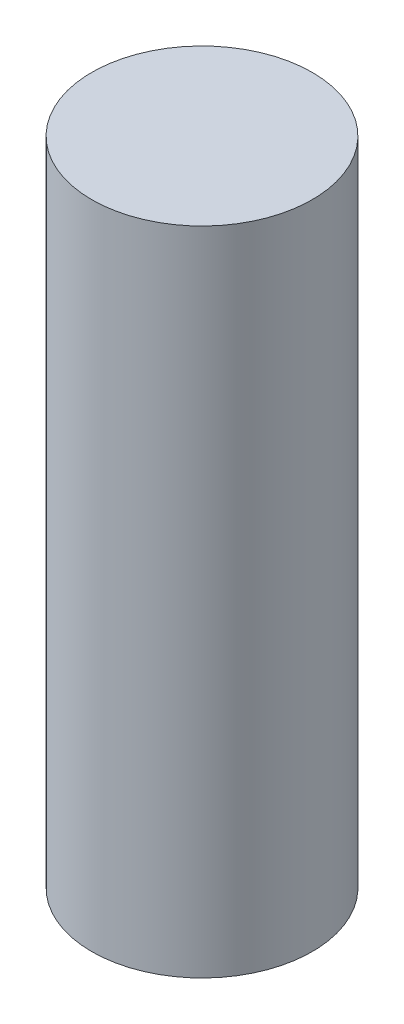
ISO-10303-21;
HEADER;
FILE_DESCRIPTION(('STEP AP214'),'2;1');
FILE_NAME('part.step','',(''),(''),'','','');
FILE_SCHEMA(('AUTOMOTIVE_DESIGN { 1 0 10303 214 1 1 1 1 }'));
ENDSEC;
DATA;
#1=APPLICATION_CONTEXT('core data for automotive mechanical design processes');
#2=APPLICATION_PROTOCOL_DEFINITION('international standard','automotive_design',2000,#1);
#3=PRODUCT_CONTEXT('',#1,'mechanical');
#4=PRODUCT('Part','Part','',(#3));
#5=PRODUCT_RELATED_PRODUCT_CATEGORY('part','',(#4));
#6=PRODUCT_DEFINITION_FORMATION('','',#4);
#7=PRODUCT_DEFINITION_CONTEXT('part definition',#1,'design');
#8=PRODUCT_DEFINITION('design','',#6,#7);
#9=PRODUCT_DEFINITION_SHAPE('','',#8);
#10=(LENGTH_UNIT() NAMED_UNIT(*) SI_UNIT(.MILLI.,.METRE.));
#11=(NAMED_UNIT(*) PLANE_ANGLE_UNIT() SI_UNIT($,.RADIAN.));
#12=(NAMED_UNIT(*) SI_UNIT($,.STERADIAN.) SOLID_ANGLE_UNIT());
#13=UNCERTAINTY_MEASURE_WITH_UNIT(LENGTH_MEASURE(1.E-05),#10,'distance_accuracy_value','');
#14=(GEOMETRIC_REPRESENTATION_CONTEXT(3) GLOBAL_UNCERTAINTY_ASSIGNED_CONTEXT((#13)) GLOBAL_UNIT_ASSIGNED_CONTEXT((#10,
#11,#12)) REPRESENTATION_CONTEXT('',''));
#15=CARTESIAN_POINT('',(0.,0.,0.));
#16=DIRECTION('',(0.,0.,1.));
#17=DIRECTION('',(1.,0.,0.));
#18=AXIS2_PLACEMENT_3D('',#15,#16,#17);
#19=CARTESIAN_POINT('',(0.,450.,0.));
#20=DIRECTION('',(0.,-1.,0.));
#21=DIRECTION('',(0.,0.,-1.));
#22=AXIS2_PLACEMENT_3D('',#19,#20,#21);
#23=CYLINDRICAL_SURFACE('',#22,76.2);
#24=CARTESIAN_POINT('',(0.,0.,0.));
#25=DIRECTION('',(0.,1.,0.));
#26=DIRECTION('',(0.,0.,1.));
#27=AXIS2_PLACEMENT_3D('',#24,#25,#26);
#28=CIRCLE('',#27,76.2);
#29=CARTESIAN_POINT('',(0.,0.,76.2));
#30=VERTEX_POINT('',#29);
#31=EDGE_CURVE('E42',#30,#30,#28,.T.);
#32=ORIENTED_EDGE('',*,*,#31,.T.);
#33=EDGE_LOOP('',(#32));
#34=FACE_BOUND('',#33,.T.);
#35=CARTESIAN_POINT('',(0.,450.,0.));
#36=DIRECTION('',(0.,1.,0.));
#37=DIRECTION('',(0.,0.,1.));
#38=AXIS2_PLACEMENT_3D('',#35,#36,#37);
#39=CIRCLE('',#38,76.2);
#40=CARTESIAN_POINT('',(0.,450.,76.2));
#41=VERTEX_POINT('',#40);
#42=EDGE_CURVE('E10',#41,#41,#39,.T.);
#43=ORIENTED_EDGE('',*,*,#42,.F.);
#44=EDGE_LOOP('',(#43));
#45=FACE_BOUND('',#44,.T.);
#46=ADVANCED_FACE('F39',(#34,#45),#23,.T.);
#47=CARTESIAN_POINT('',(0.,450.,0.));
#48=DIRECTION('',(0.,1.,0.));
#49=DIRECTION('',(0.,0.,1.));
#50=AXIS2_PLACEMENT_3D('',#47,#48,#49);
#51=PLANE('',#50);
#52=ORIENTED_EDGE('',*,*,#42,.T.);
#53=EDGE_LOOP('',(#52));
#54=FACE_BOUND('',#53,.T.);
#55=ADVANCED_FACE('F57',(#54),#51,.T.);
#56=CARTESIAN_POINT('',(0.,0.,0.));
#57=DIRECTION('',(0.,1.,0.));
#58=DIRECTION('',(0.,0.,1.));
#59=AXIS2_PLACEMENT_3D('',#56,#57,#58);
#60=PLANE('',#59);
#61=ORIENTED_EDGE('',*,*,#31,.F.);
#62=EDGE_LOOP('',(#61));
#63=FACE_BOUND('',#62,.T.);
#64=ADVANCED_FACE('F55',(#63),#60,.F.);
#65=CLOSED_SHELL('',(#46,#55,#64));
#66=MANIFOLD_SOLID_BREP('B2',#65);
#67=ADVANCED_BREP_SHAPE_REPRESENTATION('',(#18,#66),#14);
#68=SHAPE_DEFINITION_REPRESENTATION(#9,#67);
ENDSEC;
END-ISO-10303-21;
